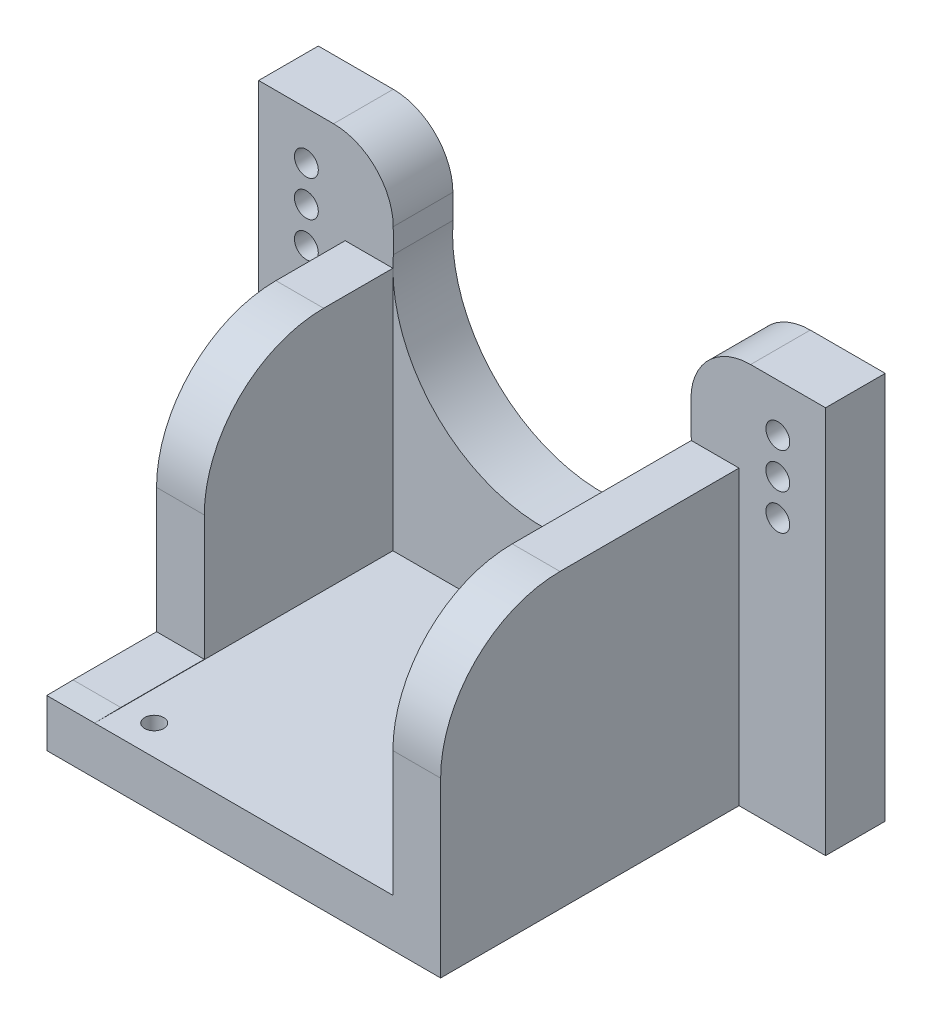
ISO-10303-21;
HEADER;
FILE_DESCRIPTION(('STEP AP214'),'2;1');
FILE_NAME('part.step','',(''),(''),'','','');
FILE_SCHEMA(('AUTOMOTIVE_DESIGN { 1 0 10303 214 1 1 1 1 }'));
ENDSEC;
DATA;
#1=APPLICATION_CONTEXT('core data for automotive mechanical design processes');
#2=APPLICATION_PROTOCOL_DEFINITION('international standard','automotive_design',2000,#1);
#3=PRODUCT_CONTEXT('',#1,'mechanical');
#4=PRODUCT('Part','Part','',(#3));
#5=PRODUCT_RELATED_PRODUCT_CATEGORY('part','',(#4));
#6=PRODUCT_DEFINITION_FORMATION('','',#4);
#7=PRODUCT_DEFINITION_CONTEXT('part definition',#1,'design');
#8=PRODUCT_DEFINITION('design','',#6,#7);
#9=PRODUCT_DEFINITION_SHAPE('','',#8);
#10=(LENGTH_UNIT() NAMED_UNIT(*) SI_UNIT(.MILLI.,.METRE.));
#11=(NAMED_UNIT(*) PLANE_ANGLE_UNIT() SI_UNIT($,.RADIAN.));
#12=(NAMED_UNIT(*) SI_UNIT($,.STERADIAN.) SOLID_ANGLE_UNIT());
#13=UNCERTAINTY_MEASURE_WITH_UNIT(LENGTH_MEASURE(1.E-05),#10,'distance_accuracy_value','');
#14=(GEOMETRIC_REPRESENTATION_CONTEXT(3) GLOBAL_UNCERTAINTY_ASSIGNED_CONTEXT((#13)) GLOBAL_UNIT_ASSIGNED_CONTEXT((#10,
#11,#12)) REPRESENTATION_CONTEXT('',''));
#15=CARTESIAN_POINT('',(0.,0.,0.));
#16=DIRECTION('',(0.,0.,1.));
#17=DIRECTION('',(1.,0.,0.));
#18=AXIS2_PLACEMENT_3D('',#15,#16,#17);
#19=CARTESIAN_POINT('',(0.,4.92242841993637,10.));
#20=DIRECTION('',(0.,0.,-1.));
#21=DIRECTION('',(-1.,0.,0.));
#22=AXIS2_PLACEMENT_3D('',#19,#20,#21);
#23=CYLINDRICAL_SURFACE('',#22,25.);
#24=CARTESIAN_POINT('',(0.,4.92242841993637,0.));
#25=DIRECTION('',(0.,0.,1.));
#26=DIRECTION('',(1.,0.,0.));
#27=AXIS2_PLACEMENT_3D('',#24,#25,#26);
#28=CIRCLE('',#27,25.);
#29=CARTESIAN_POINT('',(-24.9198715887542,6.92242841993636,0.));
#30=VERTEX_POINT('',#29);
#31=CARTESIAN_POINT('',(24.9198715887542,6.92242841993636,0.));
#32=VERTEX_POINT('',#31);
#33=EDGE_CURVE('E306',#30,#32,#28,.T.);
#34=ORIENTED_EDGE('',*,*,#33,.F.);
#35=DIRECTION('',(0.,0.,-1.));
#36=VECTOR('',#35,1.);
#37=CARTESIAN_POINT('',(-24.9198715887542,6.92242841993636,10.));
#38=LINE('',#37,#36);
#39=CARTESIAN_POINT('',(-24.9198715887542,6.92242841993636,10.));
#40=VERTEX_POINT('',#39);
#41=EDGE_CURVE('E361',#40,#30,#38,.T.);
#42=ORIENTED_EDGE('',*,*,#41,.F.);
#43=CARTESIAN_POINT('',(0.,4.92242841993637,10.));
#44=DIRECTION('',(0.,0.,1.));
#45=DIRECTION('',(1.,0.,0.));
#46=AXIS2_PLACEMENT_3D('',#43,#44,#45);
#47=CIRCLE('',#46,25.);
#48=CARTESIAN_POINT('',(-25.,4.92242841993637,10.));
#49=VERTEX_POINT('',#48);
#50=EDGE_CURVE('E307',#40,#49,#47,.T.);
#51=ORIENTED_EDGE('',*,*,#50,.T.);
#52=CARTESIAN_POINT('',(0.,4.92242841993637,10.));
#53=DIRECTION('',(0.,0.,1.));
#54=DIRECTION('',(1.,0.,0.));
#55=AXIS2_PLACEMENT_3D('',#52,#53,#54);
#56=CIRCLE('',#55,25.);
#57=CARTESIAN_POINT('',(25.,4.92242841993637,10.));
#58=VERTEX_POINT('',#57);
#59=EDGE_CURVE('E466',#49,#58,#56,.T.);
#60=ORIENTED_EDGE('',*,*,#59,.T.);
#61=CARTESIAN_POINT('',(0.,4.92242841993637,10.));
#62=DIRECTION('',(0.,0.,1.));
#63=DIRECTION('',(1.,0.,0.));
#64=AXIS2_PLACEMENT_3D('',#61,#62,#63);
#65=CIRCLE('',#64,25.);
#66=CARTESIAN_POINT('',(24.9198715887542,6.92242841993636,10.));
#67=VERTEX_POINT('',#66);
#68=EDGE_CURVE('E417',#58,#67,#65,.T.);
#69=ORIENTED_EDGE('',*,*,#68,.T.);
#70=DIRECTION('',(0.,0.,-1.));
#71=VECTOR('',#70,1.);
#72=CARTESIAN_POINT('',(24.9198715887542,6.92242841993636,10.));
#73=LINE('',#72,#71);
#74=EDGE_CURVE('E443',#67,#32,#73,.T.);
#75=ORIENTED_EDGE('',*,*,#74,.T.);
#76=EDGE_LOOP('',(#34,#42,#51,#60,#69,#75));
#77=FACE_BOUND('',#76,.T.);
#78=ADVANCED_FACE('F101',(#77),#23,.F.);
#79=CARTESIAN_POINT('',(-24.8794363609563,-0.142396407735272,10.));
#80=DIRECTION('',(0.999983621416965,0.00572336420399562,0.));
#81=DIRECTION('',(-0.00572336420399562,0.999983621416965,0.));
#82=AXIS2_PLACEMENT_3D('',#79,#80,#81);
#83=PLANE('',#82);
#84=DIRECTION('',(0.00572336420399562,-0.999983621416965,0.));
#85=VECTOR('',#84,1.);
#86=CARTESIAN_POINT('',(-24.8794363609563,-0.142396407735272,0.));
#87=LINE('',#86,#85);
#88=CARTESIAN_POINT('',(-24.943092994882,10.9796620619763,0.));
#89=VERTEX_POINT('',#88);
#90=EDGE_CURVE('E340',#89,#30,#87,.T.);
#91=ORIENTED_EDGE('',*,*,#90,.F.);
#92=DIRECTION('',(0.,0.,-1.));
#93=VECTOR('',#92,1.);
#94=CARTESIAN_POINT('',(-24.943092994882,10.9796620619763,10.));
#95=LINE('',#94,#93);
#96=CARTESIAN_POINT('',(-24.943092994882,10.9796620619763,10.));
#97=VERTEX_POINT('',#96);
#98=EDGE_CURVE('E387',#89,#97,#95,.F.);
#99=ORIENTED_EDGE('',*,*,#98,.T.);
#100=DIRECTION('',(0.00572336420399562,-0.999983621416965,0.));
#101=VECTOR('',#100,1.);
#102=CARTESIAN_POINT('',(-24.8794363609563,-0.142396407735272,10.));
#103=LINE('',#102,#101);
#104=EDGE_CURVE('E310',#97,#40,#103,.T.);
#105=ORIENTED_EDGE('',*,*,#104,.T.);
#106=ORIENTED_EDGE('',*,*,#41,.T.);
#107=EDGE_LOOP('',(#91,#99,#105,#106));
#108=FACE_BOUND('',#107,.T.);
#109=ADVANCED_FACE('F539',(#108),#83,.T.);
#110=CARTESIAN_POINT('',(0.,20.9224284199364,10.));
#111=DIRECTION('',(0.,1.,0.));
#112=DIRECTION('',(-1.,0.,0.));
#113=AXIS2_PLACEMENT_3D('',#110,#111,#112);
#114=PLANE('',#113);
#115=DIRECTION('',(1.,0.,0.));
#116=VECTOR('',#115,1.);
#117=CARTESIAN_POINT('',(0.,20.9224284199364,10.));
#118=LINE('',#117,#116);
#119=CARTESIAN_POINT('',(-47.5,20.9224284199364,10.));
#120=VERTEX_POINT('',#119);
#121=CARTESIAN_POINT('',(-34.9429292090517,20.9224284199364,10.));
#122=VERTEX_POINT('',#121);
#123=EDGE_CURVE('E313',#120,#122,#118,.T.);
#124=ORIENTED_EDGE('',*,*,#123,.T.);
#125=DIRECTION('',(0.,0.,-1.));
#126=VECTOR('',#125,1.);
#127=CARTESIAN_POINT('',(-34.9429292090517,20.9224284199364,10.));
#128=LINE('',#127,#126);
#129=CARTESIAN_POINT('',(-34.9429292090517,20.9224284199364,0.));
#130=VERTEX_POINT('',#129);
#131=EDGE_CURVE('E384',#122,#130,#128,.T.);
#132=ORIENTED_EDGE('',*,*,#131,.T.);
#133=DIRECTION('',(1.,0.,0.));
#134=VECTOR('',#133,1.);
#135=CARTESIAN_POINT('',(0.,20.9224284199364,0.));
#136=LINE('',#135,#134);
#137=CARTESIAN_POINT('',(-47.5,20.9224284199364,0.));
#138=VERTEX_POINT('',#137);
#139=EDGE_CURVE('E342',#138,#130,#136,.T.);
#140=ORIENTED_EDGE('',*,*,#139,.F.);
#141=DIRECTION('',(0.,0.,-1.));
#142=VECTOR('',#141,1.);
#143=CARTESIAN_POINT('',(-47.5,20.9224284199364,10.));
#144=LINE('',#143,#142);
#145=EDGE_CURVE('E359',#120,#138,#144,.T.);
#146=ORIENTED_EDGE('',*,*,#145,.F.);
#147=EDGE_LOOP('',(#124,#132,#140,#146));
#148=FACE_BOUND('',#147,.T.);
#149=ADVANCED_FACE('F544',(#148),#114,.T.);
#150=CARTESIAN_POINT('',(-47.5,0.,10.));
#151=DIRECTION('',(-1.,0.,0.));
#152=DIRECTION('',(0.,0.,1.));
#153=AXIS2_PLACEMENT_3D('',#150,#151,#152);
#154=PLANE('',#153);
#155=DIRECTION('',(0.,1.,0.));
#156=VECTOR('',#155,1.);
#157=CARTESIAN_POINT('',(-47.5,0.,0.));
#158=LINE('',#157,#156);
#159=CARTESIAN_POINT('',(-47.5,-44.0775715800624,0.));
#160=VERTEX_POINT('',#159);
#161=EDGE_CURVE('E345',#160,#138,#158,.T.);
#162=ORIENTED_EDGE('',*,*,#161,.F.);
#163=DIRECTION('',(0.,0.,-1.));
#164=VECTOR('',#163,1.);
#165=CARTESIAN_POINT('',(-47.5,-44.0775715800624,10.));
#166=LINE('',#165,#164);
#167=CARTESIAN_POINT('',(-47.5,-44.0775715800624,10.));
#168=VERTEX_POINT('',#167);
#169=EDGE_CURVE('E337',#168,#160,#166,.T.);
#170=ORIENTED_EDGE('',*,*,#169,.F.);
#171=DIRECTION('',(0.,1.,0.));
#172=VECTOR('',#171,1.);
#173=CARTESIAN_POINT('',(-47.5,0.,10.));
#174=LINE('',#173,#172);
#175=EDGE_CURVE('E316',#168,#120,#174,.T.);
#176=ORIENTED_EDGE('',*,*,#175,.T.);
#177=ORIENTED_EDGE('',*,*,#145,.T.);
#178=EDGE_LOOP('',(#162,#170,#176,#177));
#179=FACE_BOUND('',#178,.T.);
#180=ADVANCED_FACE('F574',(#179),#154,.T.);
#181=CARTESIAN_POINT('',(0.,-44.0775715800624,10.));
#182=DIRECTION('',(0.,1.,0.));
#183=DIRECTION('',(0.,0.,1.));
#184=AXIS2_PLACEMENT_3D('',#181,#182,#183);
#185=PLANE('',#184);
#186=CARTESIAN_POINT('',(20.,-44.0775715800624,15.));
#187=DIRECTION('',(0.,1.,0.));
#188=DIRECTION('',(0.,0.,1.));
#189=AXIS2_PLACEMENT_3D('',#186,#187,#188);
#190=CIRCLE('',#189,1.6);
#191=CARTESIAN_POINT('',(20.,-44.0775715800624,16.6));
#192=VERTEX_POINT('',#191);
#193=EDGE_CURVE('E659',#192,#192,#190,.T.);
#194=ORIENTED_EDGE('',*,*,#193,.T.);
#195=EDGE_LOOP('',(#194));
#196=FACE_BOUND('',#195,.T.);
#197=CARTESIAN_POINT('',(-20.,-44.0775715800624,55.));
#198=DIRECTION('',(0.,1.,0.));
#199=DIRECTION('',(0.,0.,1.));
#200=AXIS2_PLACEMENT_3D('',#197,#198,#199);
#201=CIRCLE('',#200,1.6);
#202=CARTESIAN_POINT('',(-20.,-44.0775715800624,56.6));
#203=VERTEX_POINT('',#202);
#204=EDGE_CURVE('E667',#203,#203,#201,.T.);
#205=ORIENTED_EDGE('',*,*,#204,.T.);
#206=EDGE_LOOP('',(#205));
#207=FACE_BOUND('',#206,.T.);
#208=DIRECTION('',(1.,0.,0.));
#209=VECTOR('',#208,1.);
#210=CARTESIAN_POINT('',(0.,-44.0775715800624,0.));
#211=LINE('',#210,#209);
#212=CARTESIAN_POINT('',(47.5,-44.0775715800624,0.));
#213=VERTEX_POINT('',#212);
#214=EDGE_CURVE('E348',#160,#213,#211,.T.);
#215=ORIENTED_EDGE('',*,*,#214,.T.);
#216=DIRECTION('',(0.,0.,-1.));
#217=VECTOR('',#216,1.);
#218=CARTESIAN_POINT('',(47.5,-44.0775715800624,10.));
#219=LINE('',#218,#217);
#220=CARTESIAN_POINT('',(47.5,-44.0775715800624,10.));
#221=VERTEX_POINT('',#220);
#222=EDGE_CURVE('E463',#221,#213,#219,.T.);
#223=ORIENTED_EDGE('',*,*,#222,.F.);
#224=DIRECTION('',(-1.,0.,0.));
#225=VECTOR('',#224,1.);
#226=CARTESIAN_POINT('',(0.,-44.0775715800624,10.));
#227=LINE('',#226,#225);
#228=CARTESIAN_POINT('',(33.,-44.0775715800624,10.));
#229=VERTEX_POINT('',#228);
#230=EDGE_CURVE('E426',#221,#229,#227,.T.);
#231=ORIENTED_EDGE('',*,*,#230,.T.);
#232=DIRECTION('',(0.,0.,-1.));
#233=VECTOR('',#232,1.);
#234=CARTESIAN_POINT('',(33.,-44.0775715800624,60.));
#235=LINE('',#234,#233);
#236=CARTESIAN_POINT('',(33.,-44.0775715800624,60.));
#237=VERTEX_POINT('',#236);
#238=EDGE_CURVE('E300',#237,#229,#235,.T.);
#239=ORIENTED_EDGE('',*,*,#238,.F.);
#240=DIRECTION('',(1.,0.,0.));
#241=VECTOR('',#240,1.);
#242=CARTESIAN_POINT('',(0.,-44.0775715800624,60.));
#243=LINE('',#242,#241);
#244=CARTESIAN_POINT('',(-33.,-44.0775715800624,60.));
#245=VERTEX_POINT('',#244);
#246=EDGE_CURVE('E477',#245,#237,#243,.T.);
#247=ORIENTED_EDGE('',*,*,#246,.F.);
#248=DIRECTION('',(0.,0.,-1.));
#249=VECTOR('',#248,1.);
#250=CARTESIAN_POINT('',(-33.,-44.0775715800624,60.));
#251=LINE('',#250,#249);
#252=CARTESIAN_POINT('',(-33.,-44.0775715800624,10.));
#253=VERTEX_POINT('',#252);
#254=EDGE_CURVE('E303',#245,#253,#251,.T.);
#255=ORIENTED_EDGE('',*,*,#254,.T.);
#256=DIRECTION('',(1.,0.,0.));
#257=VECTOR('',#256,1.);
#258=CARTESIAN_POINT('',(0.,-44.0775715800624,10.));
#259=LINE('',#258,#257);
#260=EDGE_CURVE('E319',#168,#253,#259,.T.);
#261=ORIENTED_EDGE('',*,*,#260,.F.);
#262=ORIENTED_EDGE('',*,*,#169,.T.);
#263=EDGE_LOOP('',(#215,#223,#231,#239,#247,#255,#261,#262));
#264=FACE_BOUND('',#263,.T.);
#265=ADVANCED_FACE('F494',(#196,#207,#264),#185,.F.);
#266=CARTESIAN_POINT('',(-39.5,6.92242841993636,10.));
#267=DIRECTION('',(0.,0.,-1.));
#268=DIRECTION('',(-1.,0.,0.));
#269=AXIS2_PLACEMENT_3D('',#266,#267,#268);
#270=CYLINDRICAL_SURFACE('',#269,2.);
#271=CARTESIAN_POINT('',(-39.5,6.92242841993636,10.));
#272=DIRECTION('',(0.,0.,1.));
#273=DIRECTION('',(1.,0.,0.));
#274=AXIS2_PLACEMENT_3D('',#271,#272,#273);
#275=CIRCLE('',#274,2.);
#276=CARTESIAN_POINT('',(-37.5,6.92242841993636,10.));
#277=VERTEX_POINT('',#276);
#278=EDGE_CURVE('E331',#277,#277,#275,.T.);
#279=ORIENTED_EDGE('',*,*,#278,.T.);
#280=EDGE_LOOP('',(#279));
#281=FACE_BOUND('',#280,.T.);
#282=CARTESIAN_POINT('',(-39.5,6.92242841993636,0.));
#283=DIRECTION('',(0.,0.,1.));
#284=DIRECTION('',(1.,0.,0.));
#285=AXIS2_PLACEMENT_3D('',#282,#283,#284);
#286=CIRCLE('',#285,2.);
#287=CARTESIAN_POINT('',(-37.5,6.92242841993636,0.));
#288=VERTEX_POINT('',#287);
#289=EDGE_CURVE('E353',#288,#288,#286,.T.);
#290=ORIENTED_EDGE('',*,*,#289,.F.);
#291=EDGE_LOOP('',(#290));
#292=FACE_BOUND('',#291,.T.);
#293=ADVANCED_FACE('F581',(#281,#292),#270,.F.);
#294=CARTESIAN_POINT('',(-39.5,12.9224284199364,10.));
#295=DIRECTION('',(0.,0.,-1.));
#296=DIRECTION('',(-1.,0.,0.));
#297=AXIS2_PLACEMENT_3D('',#294,#295,#296);
#298=CYLINDRICAL_SURFACE('',#297,2.);
#299=CARTESIAN_POINT('',(-39.5,12.9224284199364,10.));
#300=DIRECTION('',(0.,0.,1.));
#301=DIRECTION('',(1.,0.,0.));
#302=AXIS2_PLACEMENT_3D('',#299,#300,#301);
#303=CIRCLE('',#302,2.);
#304=CARTESIAN_POINT('',(-37.5,12.9224284199364,10.));
#305=VERTEX_POINT('',#304);
#306=EDGE_CURVE('E328',#305,#305,#303,.T.);
#307=ORIENTED_EDGE('',*,*,#306,.T.);
#308=EDGE_LOOP('',(#307));
#309=FACE_BOUND('',#308,.T.);
#310=CARTESIAN_POINT('',(-39.5,12.9224284199364,0.));
#311=DIRECTION('',(0.,0.,1.));
#312=DIRECTION('',(1.,0.,0.));
#313=AXIS2_PLACEMENT_3D('',#310,#311,#312);
#314=CIRCLE('',#313,2.);
#315=CARTESIAN_POINT('',(-37.5,12.9224284199364,0.));
#316=VERTEX_POINT('',#315);
#317=EDGE_CURVE('E350',#316,#316,#314,.T.);
#318=ORIENTED_EDGE('',*,*,#317,.F.);
#319=EDGE_LOOP('',(#318));
#320=FACE_BOUND('',#319,.T.);
#321=ADVANCED_FACE('F585',(#309,#320),#298,.F.);
#322=CARTESIAN_POINT('',(-39.5,0.922428419936359,10.));
#323=DIRECTION('',(0.,0.,-1.));
#324=DIRECTION('',(-1.,0.,0.));
#325=AXIS2_PLACEMENT_3D('',#322,#323,#324);
#326=CYLINDRICAL_SURFACE('',#325,2.);
#327=CARTESIAN_POINT('',(-39.5,0.922428419936359,10.));
#328=DIRECTION('',(0.,0.,1.));
#329=DIRECTION('',(1.,0.,0.));
#330=AXIS2_PLACEMENT_3D('',#327,#328,#329);
#331=CIRCLE('',#330,2.);
#332=CARTESIAN_POINT('',(-37.5,0.922428419936359,10.));
#333=VERTEX_POINT('',#332);
#334=EDGE_CURVE('E334',#333,#333,#331,.T.);
#335=ORIENTED_EDGE('',*,*,#334,.T.);
#336=EDGE_LOOP('',(#335));
#337=FACE_BOUND('',#336,.T.);
#338=CARTESIAN_POINT('',(-39.5,0.922428419936359,0.));
#339=DIRECTION('',(0.,0.,1.));
#340=DIRECTION('',(1.,0.,0.));
#341=AXIS2_PLACEMENT_3D('',#338,#339,#340);
#342=CIRCLE('',#341,2.);
#343=CARTESIAN_POINT('',(-37.5,0.922428419936359,0.));
#344=VERTEX_POINT('',#343);
#345=EDGE_CURVE('E311',#344,#344,#342,.T.);
#346=ORIENTED_EDGE('',*,*,#345,.F.);
#347=EDGE_LOOP('',(#346));
#348=FACE_BOUND('',#347,.T.);
#349=ADVANCED_FACE('F588',(#337,#348),#326,.F.);
#350=CARTESIAN_POINT('',(0.,0.,10.));
#351=DIRECTION('',(0.,0.,1.));
#352=DIRECTION('',(1.,0.,0.));
#353=AXIS2_PLACEMENT_3D('',#350,#351,#352);
#354=PLANE('',#353);
#355=ORIENTED_EDGE('',*,*,#104,.F.);
#356=CARTESIAN_POINT('',(-34.9429292090517,10.9224284199364,10.));
#357=DIRECTION('',(0.,0.,1.));
#358=DIRECTION('',(1.,0.,0.));
#359=AXIS2_PLACEMENT_3D('',#356,#357,#358);
#360=CIRCLE('',#359,10.);
#361=EDGE_CURVE('E389',#97,#122,#360,.T.);
#362=ORIENTED_EDGE('',*,*,#361,.T.);
#363=ORIENTED_EDGE('',*,*,#123,.F.);
#364=ORIENTED_EDGE('',*,*,#175,.F.);
#365=ORIENTED_EDGE('',*,*,#260,.T.);
#366=DIRECTION('',(0.,1.,0.));
#367=VECTOR('',#366,1.);
#368=CARTESIAN_POINT('',(-33.,0.,10.));
#369=LINE('',#368,#367);
#370=CARTESIAN_POINT('',(-33.,4.92242841993636,10.));
#371=VERTEX_POINT('',#370);
#372=EDGE_CURVE('E322',#253,#371,#369,.T.);
#373=ORIENTED_EDGE('',*,*,#372,.T.);
#374=DIRECTION('',(-1.,0.,0.));
#375=VECTOR('',#374,1.);
#376=CARTESIAN_POINT('',(0.,4.92242841993641,10.));
#377=LINE('',#376,#375);
#378=EDGE_CURVE('E325',#49,#371,#377,.T.);
#379=ORIENTED_EDGE('',*,*,#378,.F.);
#380=ORIENTED_EDGE('',*,*,#50,.F.);
#381=EDGE_LOOP('',(#355,#362,#363,#364,#365,#373,#379,#380));
#382=FACE_BOUND('',#381,.T.);
#383=ORIENTED_EDGE('',*,*,#306,.F.);
#384=EDGE_LOOP('',(#383));
#385=FACE_BOUND('',#384,.T.);
#386=ORIENTED_EDGE('',*,*,#278,.F.);
#387=EDGE_LOOP('',(#386));
#388=FACE_BOUND('',#387,.T.);
#389=ORIENTED_EDGE('',*,*,#334,.F.);
#390=EDGE_LOOP('',(#389));
#391=FACE_BOUND('',#390,.T.);
#392=ADVANCED_FACE('F488',(#382,#385,#388,#391),#354,.T.);
#393=CARTESIAN_POINT('',(0.,0.,0.));
#394=DIRECTION('',(0.,0.,1.));
#395=DIRECTION('',(1.,0.,0.));
#396=AXIS2_PLACEMENT_3D('',#393,#394,#395);
#397=PLANE('',#396);
#398=DIRECTION('',(-0.00572336420399562,-0.999983621416965,0.));
#399=VECTOR('',#398,1.);
#400=CARTESIAN_POINT('',(24.8794363609563,-0.142396407735272,0.));
#401=LINE('',#400,#399);
#402=CARTESIAN_POINT('',(24.943092994882,10.9796620619763,0.));
#403=VERTEX_POINT('',#402);
#404=EDGE_CURVE('E452',#403,#32,#401,.T.);
#405=ORIENTED_EDGE('',*,*,#404,.F.);
#406=CARTESIAN_POINT('',(34.9429292090517,10.9224284199364,0.));
#407=DIRECTION('',(0.,0.,1.));
#408=DIRECTION('',(1.,0.,0.));
#409=AXIS2_PLACEMENT_3D('',#406,#407,#408);
#410=CIRCLE('',#409,10.);
#411=CARTESIAN_POINT('',(34.9429292090517,20.9224284199364,0.));
#412=VERTEX_POINT('',#411);
#413=EDGE_CURVE('E378',#403,#412,#410,.F.);
#414=ORIENTED_EDGE('',*,*,#413,.T.);
#415=DIRECTION('',(-1.,0.,0.));
#416=VECTOR('',#415,1.);
#417=CARTESIAN_POINT('',(0.,20.9224284199364,0.));
#418=LINE('',#417,#416);
#419=CARTESIAN_POINT('',(47.5,20.9224284199364,0.));
#420=VERTEX_POINT('',#419);
#421=EDGE_CURVE('E449',#420,#412,#418,.T.);
#422=ORIENTED_EDGE('',*,*,#421,.F.);
#423=DIRECTION('',(0.,-1.,0.));
#424=VECTOR('',#423,1.);
#425=CARTESIAN_POINT('',(47.5,0.,0.));
#426=LINE('',#425,#424);
#427=EDGE_CURVE('E446',#420,#213,#426,.T.);
#428=ORIENTED_EDGE('',*,*,#427,.T.);
#429=ORIENTED_EDGE('',*,*,#214,.F.);
#430=ORIENTED_EDGE('',*,*,#161,.T.);
#431=ORIENTED_EDGE('',*,*,#139,.T.);
#432=CARTESIAN_POINT('',(-34.9429292090517,10.9224284199364,0.));
#433=DIRECTION('',(0.,0.,1.));
#434=DIRECTION('',(1.,0.,0.));
#435=AXIS2_PLACEMENT_3D('',#432,#433,#434);
#436=CIRCLE('',#435,10.);
#437=EDGE_CURVE('E376',#130,#89,#436,.F.);
#438=ORIENTED_EDGE('',*,*,#437,.T.);
#439=ORIENTED_EDGE('',*,*,#90,.T.);
#440=ORIENTED_EDGE('',*,*,#33,.T.);
#441=EDGE_LOOP('',(#405,#414,#422,#428,#429,#430,#431,#438,#439,#440));
#442=FACE_BOUND('',#441,.T.);
#443=ORIENTED_EDGE('',*,*,#317,.T.);
#444=EDGE_LOOP('',(#443));
#445=FACE_BOUND('',#444,.T.);
#446=ORIENTED_EDGE('',*,*,#289,.T.);
#447=EDGE_LOOP('',(#446));
#448=FACE_BOUND('',#447,.T.);
#449=ORIENTED_EDGE('',*,*,#345,.T.);
#450=EDGE_LOOP('',(#449));
#451=FACE_BOUND('',#450,.T.);
#452=CARTESIAN_POINT('',(39.5,12.9224284199364,0.));
#453=DIRECTION('',(0.,0.,1.));
#454=DIRECTION('',(1.,0.,0.));
#455=AXIS2_PLACEMENT_3D('',#452,#453,#454);
#456=CIRCLE('',#455,2.);
#457=CARTESIAN_POINT('',(41.5,12.9224284199364,0.));
#458=VERTEX_POINT('',#457);
#459=EDGE_CURVE('E412',#458,#458,#456,.F.);
#460=ORIENTED_EDGE('',*,*,#459,.F.);
#461=EDGE_LOOP('',(#460));
#462=FACE_BOUND('',#461,.T.);
#463=CARTESIAN_POINT('',(39.5,0.922428419936359,0.));
#464=DIRECTION('',(0.,0.,1.));
#465=DIRECTION('',(1.,0.,0.));
#466=AXIS2_PLACEMENT_3D('',#463,#464,#465);
#467=CIRCLE('',#466,2.);
#468=CARTESIAN_POINT('',(41.5,0.922428419936359,0.));
#469=VERTEX_POINT('',#468);
#470=EDGE_CURVE('E454',#469,#469,#467,.F.);
#471=ORIENTED_EDGE('',*,*,#470,.F.);
#472=EDGE_LOOP('',(#471));
#473=FACE_BOUND('',#472,.T.);
#474=CARTESIAN_POINT('',(39.5,6.92242841993636,0.));
#475=DIRECTION('',(0.,0.,1.));
#476=DIRECTION('',(1.,0.,0.));
#477=AXIS2_PLACEMENT_3D('',#474,#475,#476);
#478=CIRCLE('',#477,2.);
#479=CARTESIAN_POINT('',(41.5,6.92242841993636,0.));
#480=VERTEX_POINT('',#479);
#481=EDGE_CURVE('E418',#480,#480,#478,.F.);
#482=ORIENTED_EDGE('',*,*,#481,.F.);
#483=EDGE_LOOP('',(#482));
#484=FACE_BOUND('',#483,.T.);
#485=ADVANCED_FACE('F564',(#442,#445,#448,#451,#462,#473,#484),#397,.F.);
#486=CARTESIAN_POINT('',(-33.,0.,60.));
#487=DIRECTION('',(1.,0.,0.));
#488=DIRECTION('',(0.,1.,0.));
#489=AXIS2_PLACEMENT_3D('',#486,#487,#488);
#490=PLANE('',#489);
#491=DIRECTION('',(0.,-1.,0.));
#492=VECTOR('',#491,1.);
#493=CARTESIAN_POINT('',(-33.,-22.3299372607291,41.6061783795839));
#494=LINE('',#493,#492);
#495=CARTESIAN_POINT('',(-33.,-15.0775715800636,41.6061783795839));
#496=VERTEX_POINT('',#495);
#497=CARTESIAN_POINT('',(-33.,-36.0252058993957,41.6061783795839));
#498=VERTEX_POINT('',#497);
#499=EDGE_CURVE('E398',#496,#498,#494,.T.);
#500=ORIENTED_EDGE('',*,*,#499,.F.);
#501=CARTESIAN_POINT('',(-33.,-15.0775715800636,21.6061783795839));
#502=DIRECTION('',(1.,0.,0.));
#503=DIRECTION('',(0.,1.,0.));
#504=AXIS2_PLACEMENT_3D('',#501,#502,#503);
#505=CIRCLE('',#504,20.);
#506=CARTESIAN_POINT('',(-33.,4.92242841993636,21.6061783795839));
#507=VERTEX_POINT('',#506);
#508=EDGE_CURVE('E123',#496,#507,#505,.F.);
#509=ORIENTED_EDGE('',*,*,#508,.T.);
#510=DIRECTION('',(0.,0.,-1.));
#511=VECTOR('',#510,1.);
#512=CARTESIAN_POINT('',(-33.,4.92242841993636,60.));
#513=LINE('',#512,#511);
#514=EDGE_CURVE('E284',#507,#371,#513,.T.);
#515=ORIENTED_EDGE('',*,*,#514,.T.);
#516=ORIENTED_EDGE('',*,*,#372,.F.);
#517=ORIENTED_EDGE('',*,*,#254,.F.);
#518=DIRECTION('',(0.,-1.,0.));
#519=VECTOR('',#518,1.);
#520=CARTESIAN_POINT('',(-33.,0.,60.));
#521=LINE('',#520,#519);
#522=CARTESIAN_POINT('',(-33.,-36.0775715800624,60.));
#523=VERTEX_POINT('',#522);
#524=EDGE_CURVE('E475',#523,#245,#521,.T.);
#525=ORIENTED_EDGE('',*,*,#524,.F.);
#526=DIRECTION('',(0.,-0.011883763748076,0.999929385586392));
#527=VECTOR('',#526,1.);
#528=CARTESIAN_POINT('',(-33.,-36.0775715800624,60.));
#529=LINE('',#528,#527);
#530=CARTESIAN_POINT('',(-33.,-36.0252058993957,55.5938216204162));
#531=VERTEX_POINT('',#530);
#532=EDGE_CURVE('E257',#531,#523,#529,.T.);
#533=ORIENTED_EDGE('',*,*,#532,.F.);
#534=DIRECTION('',(0.,0.,1.));
#535=VECTOR('',#534,1.);
#536=CARTESIAN_POINT('',(-33.,-36.0252058993957,41.6061783795839));
#537=LINE('',#536,#535);
#538=EDGE_CURVE('E262',#498,#531,#537,.T.);
#539=ORIENTED_EDGE('',*,*,#538,.F.);
#540=EDGE_LOOP('',(#500,#509,#515,#516,#517,#525,#533,#539));
#541=FACE_BOUND('',#540,.T.);
#542=ADVANCED_FACE('F404',(#541),#490,.F.);
#543=CARTESIAN_POINT('',(33.,0.,60.));
#544=DIRECTION('',(-1.,0.,0.));
#545=DIRECTION('',(0.,-1.,0.));
#546=AXIS2_PLACEMENT_3D('',#543,#544,#545);
#547=PLANE('',#546);
#548=DIRECTION('',(0.,0.,-1.));
#549=VECTOR('',#548,1.);
#550=CARTESIAN_POINT('',(33.,4.92242841993636,60.));
#551=LINE('',#550,#549);
#552=CARTESIAN_POINT('',(33.,4.92242841993636,40.));
#553=VERTEX_POINT('',#552);
#554=CARTESIAN_POINT('',(33.,4.92242841993636,10.));
#555=VERTEX_POINT('',#554);
#556=EDGE_CURVE('E298',#553,#555,#551,.T.);
#557=ORIENTED_EDGE('',*,*,#556,.F.);
#558=CARTESIAN_POINT('',(33.,-15.0775715800636,40.));
#559=DIRECTION('',(-1.,0.,0.));
#560=DIRECTION('',(0.,-1.,0.));
#561=AXIS2_PLACEMENT_3D('',#558,#559,#560);
#562=CIRCLE('',#561,20.);
#563=CARTESIAN_POINT('',(33.,-15.0775715800636,60.));
#564=VERTEX_POINT('',#563);
#565=EDGE_CURVE('E367',#553,#564,#562,.F.);
#566=ORIENTED_EDGE('',*,*,#565,.T.);
#567=DIRECTION('',(0.,1.,0.));
#568=VECTOR('',#567,1.);
#569=CARTESIAN_POINT('',(33.,0.,60.));
#570=LINE('',#569,#568);
#571=EDGE_CURVE('E479',#237,#564,#570,.T.);
#572=ORIENTED_EDGE('',*,*,#571,.F.);
#573=ORIENTED_EDGE('',*,*,#238,.T.);
#574=DIRECTION('',(0.,-1.,0.));
#575=VECTOR('',#574,1.);
#576=CARTESIAN_POINT('',(33.,0.,10.));
#577=LINE('',#576,#575);
#578=EDGE_CURVE('E424',#555,#229,#577,.T.);
#579=ORIENTED_EDGE('',*,*,#578,.F.);
#580=EDGE_LOOP('',(#557,#566,#572,#573,#579));
#581=FACE_BOUND('',#580,.T.);
#582=ADVANCED_FACE('F504',(#581),#547,.F.);
#583=CARTESIAN_POINT('',(0.,4.92242841993641,60.));
#584=DIRECTION('',(0.,1.,0.));
#585=DIRECTION('',(-1.,0.,0.));
#586=AXIS2_PLACEMENT_3D('',#583,#584,#585);
#587=PLANE('',#586);
#588=DIRECTION('',(0.,0.,-1.));
#589=VECTOR('',#588,1.);
#590=CARTESIAN_POINT('',(25.,4.92242841993637,60.));
#591=LINE('',#590,#589);
#592=CARTESIAN_POINT('',(25.,4.92242841993637,40.));
#593=VERTEX_POINT('',#592);
#594=EDGE_CURVE('E292',#593,#58,#591,.T.);
#595=ORIENTED_EDGE('',*,*,#594,.F.);
#596=DIRECTION('',(1.,0.,0.));
#597=VECTOR('',#596,1.);
#598=CARTESIAN_POINT('',(0.,4.92242841993641,40.));
#599=LINE('',#598,#597);
#600=EDGE_CURVE('E364',#593,#553,#599,.T.);
#601=ORIENTED_EDGE('',*,*,#600,.T.);
#602=ORIENTED_EDGE('',*,*,#556,.T.);
#603=DIRECTION('',(1.,0.,0.));
#604=VECTOR('',#603,1.);
#605=CARTESIAN_POINT('',(0.,4.92242841993641,10.));
#606=LINE('',#605,#604);
#607=EDGE_CURVE('E421',#58,#555,#606,.T.);
#608=ORIENTED_EDGE('',*,*,#607,.F.);
#609=EDGE_LOOP('',(#595,#601,#602,#608));
#610=FACE_BOUND('',#609,.T.);
#611=ADVANCED_FACE('F511',(#610),#587,.T.);
#612=CARTESIAN_POINT('',(25.,0.,60.));
#613=DIRECTION('',(-1.,0.,0.));
#614=DIRECTION('',(0.,0.,1.));
#615=AXIS2_PLACEMENT_3D('',#612,#613,#614);
#616=PLANE('',#615);
#617=DIRECTION('',(0.,1.,0.));
#618=VECTOR('',#617,1.);
#619=CARTESIAN_POINT('',(25.,0.,60.));
#620=LINE('',#619,#618);
#621=CARTESIAN_POINT('',(25.,-36.0775715800636,60.));
#622=VERTEX_POINT('',#621);
#623=CARTESIAN_POINT('',(25.,-15.0775715800636,60.));
#624=VERTEX_POINT('',#623);
#625=EDGE_CURVE('E281',#622,#624,#620,.T.);
#626=ORIENTED_EDGE('',*,*,#625,.T.);
#627=CARTESIAN_POINT('',(25.,-15.0775715800636,40.));
#628=DIRECTION('',(-1.,0.,0.));
#629=DIRECTION('',(0.,0.,1.));
#630=AXIS2_PLACEMENT_3D('',#627,#628,#629);
#631=CIRCLE('',#630,20.);
#632=EDGE_CURVE('E371',#624,#593,#631,.T.);
#633=ORIENTED_EDGE('',*,*,#632,.T.);
#634=ORIENTED_EDGE('',*,*,#594,.T.);
#635=DIRECTION('',(0.,1.,0.));
#636=VECTOR('',#635,1.);
#637=CARTESIAN_POINT('',(25.,0.,10.));
#638=LINE('',#637,#636);
#639=CARTESIAN_POINT('',(25.,-36.0775715800636,10.));
#640=VERTEX_POINT('',#639);
#641=EDGE_CURVE('E472',#640,#58,#638,.T.);
#642=ORIENTED_EDGE('',*,*,#641,.F.);
#643=DIRECTION('',(0.,0.,-1.));
#644=VECTOR('',#643,1.);
#645=CARTESIAN_POINT('',(25.,-36.0775715800636,60.));
#646=LINE('',#645,#644);
#647=EDGE_CURVE('E289',#622,#640,#646,.T.);
#648=ORIENTED_EDGE('',*,*,#647,.F.);
#649=EDGE_LOOP('',(#626,#633,#634,#642,#648));
#650=FACE_BOUND('',#649,.T.);
#651=ADVANCED_FACE('F515',(#650),#616,.T.);
#652=CARTESIAN_POINT('',(0.,-36.0775715800636,60.));
#653=DIRECTION('',(0.,-1.,0.));
#654=DIRECTION('',(0.,0.,-1.));
#655=AXIS2_PLACEMENT_3D('',#652,#653,#654);
#656=PLANE('',#655);
#657=CARTESIAN_POINT('',(20.,-36.0775715800636,15.));
#658=DIRECTION('',(0.,1.,0.));
#659=DIRECTION('',(0.,0.,1.));
#660=AXIS2_PLACEMENT_3D('',#657,#658,#659);
#661=CIRCLE('',#660,1.6);
#662=CARTESIAN_POINT('',(20.,-36.0775715800636,16.6));
#663=VERTEX_POINT('',#662);
#664=EDGE_CURVE('E662',#663,#663,#661,.T.);
#665=ORIENTED_EDGE('',*,*,#664,.F.);
#666=EDGE_LOOP('',(#665));
#667=FACE_BOUND('',#666,.T.);
#668=CARTESIAN_POINT('',(-20.,-36.0775715800636,55.));
#669=DIRECTION('',(0.,1.,0.));
#670=DIRECTION('',(0.,0.,1.));
#671=AXIS2_PLACEMENT_3D('',#668,#669,#670);
#672=CIRCLE('',#671,1.6);
#673=CARTESIAN_POINT('',(-20.,-36.0775715800636,56.6));
#674=VERTEX_POINT('',#673);
#675=EDGE_CURVE('E664',#674,#674,#672,.T.);
#676=ORIENTED_EDGE('',*,*,#675,.F.);
#677=EDGE_LOOP('',(#676));
#678=FACE_BOUND('',#677,.T.);
#679=ORIENTED_EDGE('',*,*,#647,.T.);
#680=DIRECTION('',(1.,0.,0.));
#681=VECTOR('',#680,1.);
#682=CARTESIAN_POINT('',(0.,-36.0775715800636,10.));
#683=LINE('',#682,#681);
#684=CARTESIAN_POINT('',(-25.,-36.0775715800636,10.));
#685=VERTEX_POINT('',#684);
#686=EDGE_CURVE('E288',#685,#640,#683,.T.);
#687=ORIENTED_EDGE('',*,*,#686,.F.);
#688=DIRECTION('',(0.,0.,-1.));
#689=VECTOR('',#688,1.);
#690=CARTESIAN_POINT('',(-25.,-36.0775715800636,60.));
#691=LINE('',#690,#689);
#692=CARTESIAN_POINT('',(-25.,-36.0775715800636,60.));
#693=VERTEX_POINT('',#692);
#694=EDGE_CURVE('E269',#693,#685,#691,.T.);
#695=ORIENTED_EDGE('',*,*,#694,.F.);
#696=DIRECTION('',(-1.,0.,0.));
#697=VECTOR('',#696,1.);
#698=CARTESIAN_POINT('',(0.,-36.0775715800636,60.));
#699=LINE('',#698,#697);
#700=EDGE_CURVE('E277',#622,#693,#699,.T.);
#701=ORIENTED_EDGE('',*,*,#700,.F.);
#702=EDGE_LOOP('',(#679,#687,#695,#701));
#703=FACE_BOUND('',#702,.T.);
#704=ADVANCED_FACE('F286',(#667,#678,#703),#656,.F.);
#705=CARTESIAN_POINT('',(-25.,0.,60.));
#706=DIRECTION('',(-1.,0.,0.));
#707=DIRECTION('',(0.,0.,1.));
#708=AXIS2_PLACEMENT_3D('',#705,#706,#707);
#709=PLANE('',#708);
#710=DIRECTION('',(0.,0.,-1.));
#711=VECTOR('',#710,1.);
#712=CARTESIAN_POINT('',(-25.,4.92242841993637,60.));
#713=LINE('',#712,#711);
#714=CARTESIAN_POINT('',(-25.,4.92242841993637,21.6061783795839));
#715=VERTEX_POINT('',#714);
#716=EDGE_CURVE('E290',#715,#49,#713,.T.);
#717=ORIENTED_EDGE('',*,*,#716,.F.);
#718=CARTESIAN_POINT('',(-25.,-15.0775715800636,21.6061783795839));
#719=DIRECTION('',(-1.,0.,0.));
#720=DIRECTION('',(0.,0.,1.));
#721=AXIS2_PLACEMENT_3D('',#718,#719,#720);
#722=CIRCLE('',#721,20.);
#723=CARTESIAN_POINT('',(-25.,-15.0775715800636,41.6061783795839));
#724=VERTEX_POINT('',#723);
#725=EDGE_CURVE('E12',#715,#724,#722,.F.);
#726=ORIENTED_EDGE('',*,*,#725,.T.);
#727=DIRECTION('',(0.,1.,0.));
#728=VECTOR('',#727,1.);
#729=CARTESIAN_POINT('',(-25.,-22.3299372607291,41.6061783795839));
#730=LINE('',#729,#728);
#731=CARTESIAN_POINT('',(-25.,-36.0252058993957,41.6061783795839));
#732=VERTEX_POINT('',#731);
#733=EDGE_CURVE('E400',#732,#724,#730,.T.);
#734=ORIENTED_EDGE('',*,*,#733,.F.);
#735=DIRECTION('',(0.,0.,-1.));
#736=VECTOR('',#735,1.);
#737=CARTESIAN_POINT('',(-25.,-36.0252058993957,41.6061783795839));
#738=LINE('',#737,#736);
#739=CARTESIAN_POINT('',(-25.,-36.0252058993957,55.5938216204162));
#740=VERTEX_POINT('',#739);
#741=EDGE_CURVE('E273',#740,#732,#738,.T.);
#742=ORIENTED_EDGE('',*,*,#741,.F.);
#743=DIRECTION('',(0.,0.011883763748076,-0.999929385586392));
#744=VECTOR('',#743,1.);
#745=CARTESIAN_POINT('',(-25.,-36.0775715800624,60.));
#746=LINE('',#745,#744);
#747=EDGE_CURVE('E254',#693,#740,#746,.T.);
#748=ORIENTED_EDGE('',*,*,#747,.F.);
#749=ORIENTED_EDGE('',*,*,#694,.T.);
#750=DIRECTION('',(0.,1.,0.));
#751=VECTOR('',#750,1.);
#752=CARTESIAN_POINT('',(-25.,0.,10.));
#753=LINE('',#752,#751);
#754=EDGE_CURVE('E469',#685,#49,#753,.T.);
#755=ORIENTED_EDGE('',*,*,#754,.T.);
#756=EDGE_LOOP('',(#717,#726,#734,#742,#748,#749,#755));
#757=FACE_BOUND('',#756,.T.);
#758=ADVANCED_FACE('F266',(#757),#709,.F.);
#759=CARTESIAN_POINT('',(0.,4.92242841993641,60.));
#760=DIRECTION('',(0.,-1.,0.));
#761=DIRECTION('',(1.,0.,0.));
#762=AXIS2_PLACEMENT_3D('',#759,#760,#761);
#763=PLANE('',#762);
#764=ORIENTED_EDGE('',*,*,#514,.F.);
#765=DIRECTION('',(-1.,0.,0.));
#766=VECTOR('',#765,1.);
#767=CARTESIAN_POINT('',(0.,4.92242841993641,21.6061783795839));
#768=LINE('',#767,#766);
#769=EDGE_CURVE('E109',#507,#715,#768,.F.);
#770=ORIENTED_EDGE('',*,*,#769,.T.);
#771=ORIENTED_EDGE('',*,*,#716,.T.);
#772=ORIENTED_EDGE('',*,*,#378,.T.);
#773=EDGE_LOOP('',(#764,#770,#771,#772));
#774=FACE_BOUND('',#773,.T.);
#775=ADVANCED_FACE('F483',(#774),#763,.F.);
#776=CARTESIAN_POINT('',(0.,0.,60.));
#777=DIRECTION('',(0.,0.,1.));
#778=DIRECTION('',(1.,0.,0.));
#779=AXIS2_PLACEMENT_3D('',#776,#777,#778);
#780=PLANE('',#779);
#781=ORIENTED_EDGE('',*,*,#571,.T.);
#782=DIRECTION('',(1.,0.,0.));
#783=VECTOR('',#782,1.);
#784=CARTESIAN_POINT('',(0.,-15.0775715800636,60.));
#785=LINE('',#784,#783);
#786=EDGE_CURVE('E369',#564,#624,#785,.F.);
#787=ORIENTED_EDGE('',*,*,#786,.T.);
#788=ORIENTED_EDGE('',*,*,#625,.F.);
#789=ORIENTED_EDGE('',*,*,#700,.T.);
#790=DIRECTION('',(-1.,0.,0.));
#791=VECTOR('',#790,1.);
#792=CARTESIAN_POINT('',(47.501,-36.0775715800624,60.));
#793=LINE('',#792,#791);
#794=EDGE_CURVE('E251',#693,#523,#793,.T.);
#795=ORIENTED_EDGE('',*,*,#794,.T.);
#796=ORIENTED_EDGE('',*,*,#524,.T.);
#797=ORIENTED_EDGE('',*,*,#246,.T.);
#798=EDGE_LOOP('',(#781,#787,#788,#789,#795,#796,#797));
#799=FACE_BOUND('',#798,.T.);
#800=ADVANCED_FACE('F279',(#799),#780,.T.);
#801=CARTESIAN_POINT('',(0.,0.,10.));
#802=DIRECTION('',(0.,0.,1.));
#803=DIRECTION('',(1.,0.,0.));
#804=AXIS2_PLACEMENT_3D('',#801,#802,#803);
#805=PLANE('',#804);
#806=ORIENTED_EDGE('',*,*,#59,.F.);
#807=ORIENTED_EDGE('',*,*,#754,.F.);
#808=ORIENTED_EDGE('',*,*,#686,.T.);
#809=ORIENTED_EDGE('',*,*,#641,.T.);
#810=EDGE_LOOP('',(#806,#807,#808,#809));
#811=FACE_BOUND('',#810,.T.);
#812=ADVANCED_FACE('F525',(#811),#805,.T.);
#813=CARTESIAN_POINT('',(47.5,0.,10.));
#814=DIRECTION('',(1.,0.,0.));
#815=DIRECTION('',(0.,0.,-1.));
#816=AXIS2_PLACEMENT_3D('',#813,#814,#815);
#817=PLANE('',#816);
#818=ORIENTED_EDGE('',*,*,#427,.F.);
#819=DIRECTION('',(0.,0.,-1.));
#820=VECTOR('',#819,1.);
#821=CARTESIAN_POINT('',(47.5,20.9224284199364,10.));
#822=LINE('',#821,#820);
#823=CARTESIAN_POINT('',(47.5,20.9224284199364,10.));
#824=VERTEX_POINT('',#823);
#825=EDGE_CURVE('E461',#824,#420,#822,.T.);
#826=ORIENTED_EDGE('',*,*,#825,.F.);
#827=DIRECTION('',(0.,-1.,0.));
#828=VECTOR('',#827,1.);
#829=CARTESIAN_POINT('',(47.5,0.,10.));
#830=LINE('',#829,#828);
#831=EDGE_CURVE('E429',#824,#221,#830,.T.);
#832=ORIENTED_EDGE('',*,*,#831,.T.);
#833=ORIENTED_EDGE('',*,*,#222,.T.);
#834=EDGE_LOOP('',(#818,#826,#832,#833));
#835=FACE_BOUND('',#834,.T.);
#836=ADVANCED_FACE('F619',(#835),#817,.T.);
#837=CARTESIAN_POINT('',(0.,20.9224284199364,10.));
#838=DIRECTION('',(0.,-1.,0.));
#839=DIRECTION('',(1.,0.,0.));
#840=AXIS2_PLACEMENT_3D('',#837,#838,#839);
#841=PLANE('',#840);
#842=ORIENTED_EDGE('',*,*,#421,.T.);
#843=DIRECTION('',(0.,0.,-1.));
#844=VECTOR('',#843,1.);
#845=CARTESIAN_POINT('',(34.9429292090517,20.9224284199364,10.));
#846=LINE('',#845,#844);
#847=CARTESIAN_POINT('',(34.9429292090517,20.9224284199364,10.));
#848=VERTEX_POINT('',#847);
#849=EDGE_CURVE('E380',#412,#848,#846,.F.);
#850=ORIENTED_EDGE('',*,*,#849,.T.);
#851=DIRECTION('',(-1.,0.,0.));
#852=VECTOR('',#851,1.);
#853=CARTESIAN_POINT('',(0.,20.9224284199364,10.));
#854=LINE('',#853,#852);
#855=EDGE_CURVE('E432',#824,#848,#854,.T.);
#856=ORIENTED_EDGE('',*,*,#855,.F.);
#857=ORIENTED_EDGE('',*,*,#825,.T.);
#858=EDGE_LOOP('',(#842,#850,#856,#857));
#859=FACE_BOUND('',#858,.T.);
#860=ADVANCED_FACE('F627',(#859),#841,.F.);
#861=CARTESIAN_POINT('',(39.5,0.922428419936359,10.));
#862=DIRECTION('',(0.,0.,-1.));
#863=DIRECTION('',(-1.,0.,0.));
#864=AXIS2_PLACEMENT_3D('',#861,#862,#863);
#865=CYLINDRICAL_SURFACE('',#864,2.);
#866=CARTESIAN_POINT('',(39.5,0.922428419936359,10.));
#867=DIRECTION('',(0.,0.,1.));
#868=DIRECTION('',(1.,0.,0.));
#869=AXIS2_PLACEMENT_3D('',#866,#867,#868);
#870=CIRCLE('',#869,2.);
#871=CARTESIAN_POINT('',(41.5,0.922428419936359,10.));
#872=VERTEX_POINT('',#871);
#873=EDGE_CURVE('E437',#872,#872,#870,.F.);
#874=ORIENTED_EDGE('',*,*,#873,.F.);
#875=EDGE_LOOP('',(#874));
#876=FACE_BOUND('',#875,.T.);
#877=ORIENTED_EDGE('',*,*,#470,.T.);
#878=EDGE_LOOP('',(#877));
#879=FACE_BOUND('',#878,.T.);
#880=ADVANCED_FACE('F631',(#876,#879),#865,.F.);
#881=CARTESIAN_POINT('',(24.8794363609563,-0.142396407735272,10.));
#882=DIRECTION('',(0.999983621416965,-0.00572336420399562,0.));
#883=DIRECTION('',(0.00572336420399562,0.999983621416965,0.));
#884=AXIS2_PLACEMENT_3D('',#881,#882,#883);
#885=PLANE('',#884);
#886=DIRECTION('',(-0.00572336420399562,-0.999983621416965,0.));
#887=VECTOR('',#886,1.);
#888=CARTESIAN_POINT('',(24.8794363609563,-0.142396407735272,10.));
#889=LINE('',#888,#887);
#890=CARTESIAN_POINT('',(24.943092994882,10.9796620619763,10.));
#891=VERTEX_POINT('',#890);
#892=EDGE_CURVE('E435',#891,#67,#889,.T.);
#893=ORIENTED_EDGE('',*,*,#892,.F.);
#894=DIRECTION('',(0.,0.,-1.));
#895=VECTOR('',#894,1.);
#896=CARTESIAN_POINT('',(24.943092994882,10.9796620619763,10.));
#897=LINE('',#896,#895);
#898=EDGE_CURVE('E373',#891,#403,#897,.T.);
#899=ORIENTED_EDGE('',*,*,#898,.T.);
#900=ORIENTED_EDGE('',*,*,#404,.T.);
#901=ORIENTED_EDGE('',*,*,#74,.F.);
#902=EDGE_LOOP('',(#893,#899,#900,#901));
#903=FACE_BOUND('',#902,.T.);
#904=ADVANCED_FACE('F561',(#903),#885,.F.);
#905=CARTESIAN_POINT('',(39.5,12.9224284199364,10.));
#906=DIRECTION('',(0.,0.,-1.));
#907=DIRECTION('',(-1.,0.,0.));
#908=AXIS2_PLACEMENT_3D('',#905,#906,#907);
#909=CYLINDRICAL_SURFACE('',#908,2.);
#910=CARTESIAN_POINT('',(39.5,12.9224284199364,10.));
#911=DIRECTION('',(0.,0.,1.));
#912=DIRECTION('',(1.,0.,0.));
#913=AXIS2_PLACEMENT_3D('',#910,#911,#912);
#914=CIRCLE('',#913,2.);
#915=CARTESIAN_POINT('',(41.5,12.9224284199364,10.));
#916=VERTEX_POINT('',#915);
#917=EDGE_CURVE('E414',#916,#916,#914,.F.);
#918=ORIENTED_EDGE('',*,*,#917,.F.);
#919=EDGE_LOOP('',(#918));
#920=FACE_BOUND('',#919,.T.);
#921=ORIENTED_EDGE('',*,*,#459,.T.);
#922=EDGE_LOOP('',(#921));
#923=FACE_BOUND('',#922,.T.);
#924=ADVANCED_FACE('F620',(#920,#923),#909,.F.);
#925=CARTESIAN_POINT('',(39.5,6.92242841993636,10.));
#926=DIRECTION('',(0.,0.,-1.));
#927=DIRECTION('',(-1.,0.,0.));
#928=AXIS2_PLACEMENT_3D('',#925,#926,#927);
#929=CYLINDRICAL_SURFACE('',#928,2.);
#930=CARTESIAN_POINT('',(39.5,6.92242841993636,10.));
#931=DIRECTION('',(0.,0.,1.));
#932=DIRECTION('',(1.,0.,0.));
#933=AXIS2_PLACEMENT_3D('',#930,#931,#932);
#934=CIRCLE('',#933,2.);
#935=CARTESIAN_POINT('',(41.5,6.92242841993636,10.));
#936=VERTEX_POINT('',#935);
#937=EDGE_CURVE('E440',#936,#936,#934,.F.);
#938=ORIENTED_EDGE('',*,*,#937,.F.);
#939=EDGE_LOOP('',(#938));
#940=FACE_BOUND('',#939,.T.);
#941=ORIENTED_EDGE('',*,*,#481,.T.);
#942=EDGE_LOOP('',(#941));
#943=FACE_BOUND('',#942,.T.);
#944=ADVANCED_FACE('F623',(#940,#943),#929,.F.);
#945=CARTESIAN_POINT('',(0.,0.,10.));
#946=DIRECTION('',(0.,0.,1.));
#947=DIRECTION('',(1.,0.,0.));
#948=AXIS2_PLACEMENT_3D('',#945,#946,#947);
#949=PLANE('',#948);
#950=ORIENTED_EDGE('',*,*,#917,.T.);
#951=EDGE_LOOP('',(#950));
#952=FACE_BOUND('',#951,.T.);
#953=ORIENTED_EDGE('',*,*,#855,.T.);
#954=CARTESIAN_POINT('',(34.9429292090517,10.9224284199364,10.));
#955=DIRECTION('',(0.,0.,1.));
#956=DIRECTION('',(1.,0.,0.));
#957=AXIS2_PLACEMENT_3D('',#954,#955,#956);
#958=CIRCLE('',#957,10.);
#959=EDGE_CURVE('E382',#848,#891,#958,.T.);
#960=ORIENTED_EDGE('',*,*,#959,.T.);
#961=ORIENTED_EDGE('',*,*,#892,.T.);
#962=ORIENTED_EDGE('',*,*,#68,.F.);
#963=ORIENTED_EDGE('',*,*,#607,.T.);
#964=ORIENTED_EDGE('',*,*,#578,.T.);
#965=ORIENTED_EDGE('',*,*,#230,.F.);
#966=ORIENTED_EDGE('',*,*,#831,.F.);
#967=EDGE_LOOP('',(#953,#960,#961,#962,#963,#964,#965,#966));
#968=FACE_BOUND('',#967,.T.);
#969=ORIENTED_EDGE('',*,*,#873,.T.);
#970=EDGE_LOOP('',(#969));
#971=FACE_BOUND('',#970,.T.);
#972=ORIENTED_EDGE('',*,*,#937,.T.);
#973=EDGE_LOOP('',(#972));
#974=FACE_BOUND('',#973,.T.);
#975=ADVANCED_FACE('F517',(#952,#968,#971,#974),#949,.T.);
#976=CARTESIAN_POINT('',(47.501,-22.3299372607291,41.6061783795839));
#977=DIRECTION('',(0.,0.,-1.));
#978=DIRECTION('',(0.,1.,0.));
#979=AXIS2_PLACEMENT_3D('',#976,#977,#978);
#980=PLANE('',#979);
#981=ORIENTED_EDGE('',*,*,#733,.T.);
#982=DIRECTION('',(-1.,0.,0.));
#983=VECTOR('',#982,1.);
#984=CARTESIAN_POINT('',(47.501,-15.0775715800635,41.6061783795839));
#985=LINE('',#984,#983);
#986=EDGE_CURVE('E391',#724,#496,#985,.T.);
#987=ORIENTED_EDGE('',*,*,#986,.T.);
#988=ORIENTED_EDGE('',*,*,#499,.T.);
#989=DIRECTION('',(-1.,0.,0.));
#990=VECTOR('',#989,1.);
#991=CARTESIAN_POINT('',(47.501,-36.0252058993957,41.6061783795839));
#992=LINE('',#991,#990);
#993=EDGE_CURVE('E261',#732,#498,#992,.T.);
#994=ORIENTED_EDGE('',*,*,#993,.F.);
#995=EDGE_LOOP('',(#981,#987,#988,#994));
#996=FACE_BOUND('',#995,.T.);
#997=ADVANCED_FACE('F397',(#996),#980,.F.);
#998=CARTESIAN_POINT('',(47.501,-36.0252058993957,41.6061783795839));
#999=DIRECTION('',(0.,-1.,0.));
#1000=DIRECTION('',(1.,0.,0.));
#1001=AXIS2_PLACEMENT_3D('',#998,#999,#1000);
#1002=PLANE('',#1001);
#1003=ORIENTED_EDGE('',*,*,#741,.T.);
#1004=ORIENTED_EDGE('',*,*,#993,.T.);
#1005=ORIENTED_EDGE('',*,*,#538,.T.);
#1006=DIRECTION('',(-1.,0.,0.));
#1007=VECTOR('',#1006,1.);
#1008=CARTESIAN_POINT('',(47.501,-36.0252058993957,55.5938216204162));
#1009=LINE('',#1008,#1007);
#1010=EDGE_CURVE('E410',#740,#531,#1009,.T.);
#1011=ORIENTED_EDGE('',*,*,#1010,.F.);
#1012=EDGE_LOOP('',(#1003,#1004,#1005,#1011));
#1013=FACE_BOUND('',#1012,.T.);
#1014=ADVANCED_FACE('F646',(#1013),#1002,.F.);
#1015=CARTESIAN_POINT('',(47.501,-36.0775715800624,60.));
#1016=DIRECTION('',(0.,-0.999929385586392,-0.011883763748076));
#1017=DIRECTION('',(0.,0.011883763748076,-0.999929385586392));
#1018=AXIS2_PLACEMENT_3D('',#1015,#1016,#1017);
#1019=PLANE('',#1018);
#1020=ORIENTED_EDGE('',*,*,#747,.T.);
#1021=ORIENTED_EDGE('',*,*,#1010,.T.);
#1022=ORIENTED_EDGE('',*,*,#532,.T.);
#1023=ORIENTED_EDGE('',*,*,#794,.F.);
#1024=EDGE_LOOP('',(#1020,#1021,#1022,#1023));
#1025=FACE_BOUND('',#1024,.T.);
#1026=ADVANCED_FACE('F253',(#1025),#1019,.F.);
#1027=CARTESIAN_POINT('',(0.,-15.0775715800636,40.));
#1028=DIRECTION('',(1.,0.,0.));
#1029=DIRECTION('',(0.,1.,0.));
#1030=AXIS2_PLACEMENT_3D('',#1027,#1028,#1029);
#1031=CYLINDRICAL_SURFACE('',#1030,20.);
#1032=ORIENTED_EDGE('',*,*,#632,.F.);
#1033=ORIENTED_EDGE('',*,*,#786,.F.);
#1034=ORIENTED_EDGE('',*,*,#565,.F.);
#1035=ORIENTED_EDGE('',*,*,#600,.F.);
#1036=EDGE_LOOP('',(#1032,#1033,#1034,#1035));
#1037=FACE_BOUND('',#1036,.T.);
#1038=ADVANCED_FACE('F508',(#1037),#1031,.T.);
#1039=CARTESIAN_POINT('',(34.9429292090517,10.9224284199364,10.));
#1040=DIRECTION('',(0.,0.,-1.));
#1041=DIRECTION('',(-1.,0.,0.));
#1042=AXIS2_PLACEMENT_3D('',#1039,#1040,#1041);
#1043=CYLINDRICAL_SURFACE('',#1042,10.);
#1044=ORIENTED_EDGE('',*,*,#959,.F.);
#1045=ORIENTED_EDGE('',*,*,#849,.F.);
#1046=ORIENTED_EDGE('',*,*,#413,.F.);
#1047=ORIENTED_EDGE('',*,*,#898,.F.);
#1048=EDGE_LOOP('',(#1044,#1045,#1046,#1047));
#1049=FACE_BOUND('',#1048,.T.);
#1050=ADVANCED_FACE('F536',(#1049),#1043,.T.);
#1051=CARTESIAN_POINT('',(-34.9429292090517,10.9224284199364,10.));
#1052=DIRECTION('',(0.,0.,-1.));
#1053=DIRECTION('',(-1.,0.,0.));
#1054=AXIS2_PLACEMENT_3D('',#1051,#1052,#1053);
#1055=CYLINDRICAL_SURFACE('',#1054,10.);
#1056=ORIENTED_EDGE('',*,*,#361,.F.);
#1057=ORIENTED_EDGE('',*,*,#98,.F.);
#1058=ORIENTED_EDGE('',*,*,#437,.F.);
#1059=ORIENTED_EDGE('',*,*,#131,.F.);
#1060=EDGE_LOOP('',(#1056,#1057,#1058,#1059));
#1061=FACE_BOUND('',#1060,.T.);
#1062=ADVANCED_FACE('F528',(#1061),#1055,.T.);
#1063=CARTESIAN_POINT('',(47.501,-15.0775715800635,21.6061783795839));
#1064=DIRECTION('',(-1.,0.,0.));
#1065=DIRECTION('',(0.,-1.,0.));
#1066=AXIS2_PLACEMENT_3D('',#1063,#1064,#1065);
#1067=CYLINDRICAL_SURFACE('',#1066,20.);
#1068=ORIENTED_EDGE('',*,*,#725,.F.);
#1069=ORIENTED_EDGE('',*,*,#769,.F.);
#1070=ORIENTED_EDGE('',*,*,#508,.F.);
#1071=ORIENTED_EDGE('',*,*,#986,.F.);
#1072=EDGE_LOOP('',(#1068,#1069,#1070,#1071));
#1073=FACE_BOUND('',#1072,.T.);
#1074=ADVANCED_FACE('F103',(#1073),#1067,.T.);
#1075=CARTESIAN_POINT('',(-20.,-44.0775715800624,55.));
#1076=DIRECTION('',(0.,1.,0.));
#1077=DIRECTION('',(0.,0.,1.));
#1078=AXIS2_PLACEMENT_3D('',#1075,#1076,#1077);
#1079=CYLINDRICAL_SURFACE('',#1078,1.6);
#1080=ORIENTED_EDGE('',*,*,#204,.F.);
#1081=EDGE_LOOP('',(#1080));
#1082=FACE_BOUND('',#1081,.T.);
#1083=ORIENTED_EDGE('',*,*,#675,.T.);
#1084=EDGE_LOOP('',(#1083));
#1085=FACE_BOUND('',#1084,.T.);
#1086=ADVANCED_FACE('F527',(#1082,#1085),#1079,.F.);
#1087=CARTESIAN_POINT('',(20.,-44.0775715800624,15.));
#1088=DIRECTION('',(0.,1.,0.));
#1089=DIRECTION('',(0.,0.,1.));
#1090=AXIS2_PLACEMENT_3D('',#1087,#1088,#1089);
#1091=CYLINDRICAL_SURFACE('',#1090,1.6);
#1092=ORIENTED_EDGE('',*,*,#193,.F.);
#1093=EDGE_LOOP('',(#1092));
#1094=FACE_BOUND('',#1093,.T.);
#1095=ORIENTED_EDGE('',*,*,#664,.T.);
#1096=EDGE_LOOP('',(#1095));
#1097=FACE_BOUND('',#1096,.T.);
#1098=ADVANCED_FACE('F533',(#1094,#1097),#1091,.F.);
#1099=CLOSED_SHELL('',(#78,#109,#149,#180,#265,#293,#321,#349,#392,#485,#542,#582,#611,#651,
#704,#758,#775,#800,#812,#836,#860,#880,#904,#924,#944,#975,#997,#1014,#1026,#1038,#1050,#1062,
#1074,#1086,#1098));
#1100=MANIFOLD_SOLID_BREP('B2',#1099);
#1101=ADVANCED_BREP_SHAPE_REPRESENTATION('',(#18,#1100),#14);
#1102=SHAPE_DEFINITION_REPRESENTATION(#9,#1101);
ENDSEC;
END-ISO-10303-21;
